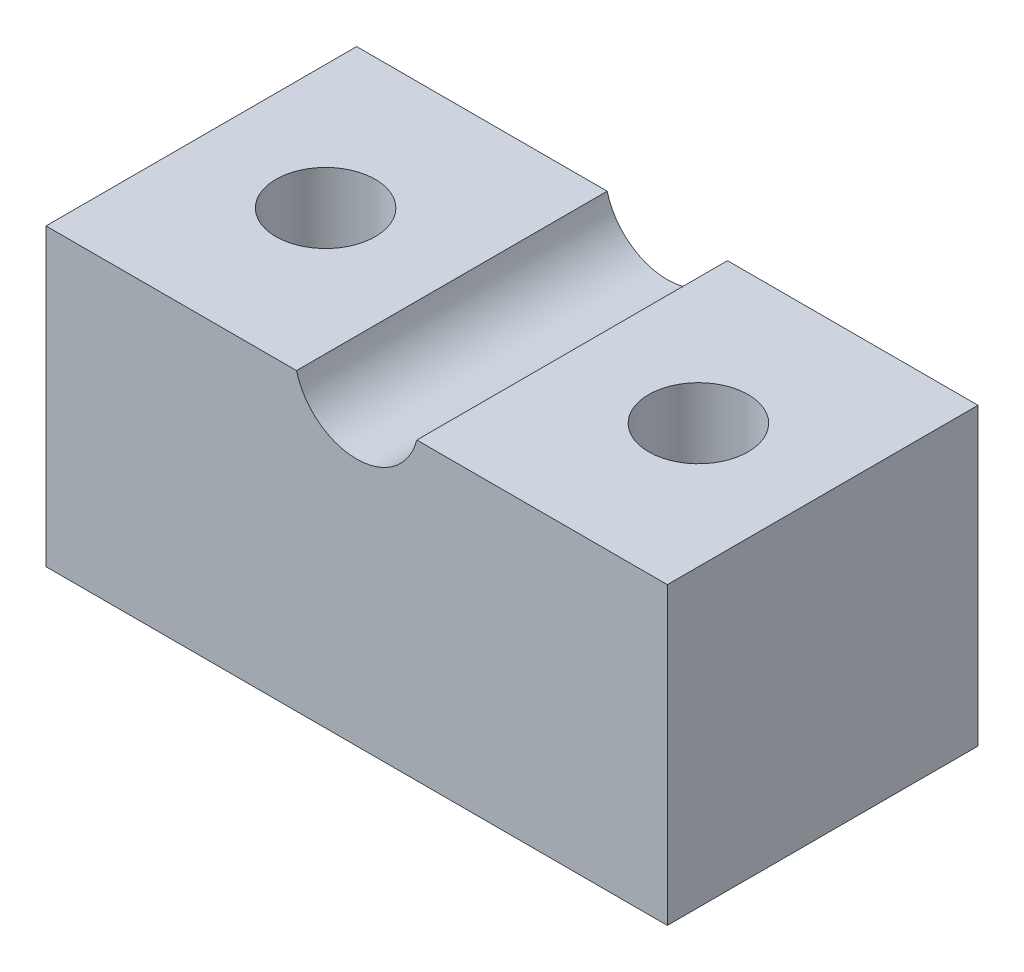
ISO-10303-21;
HEADER;
FILE_DESCRIPTION(('STEP AP214'),'2;1');
FILE_NAME('part.step','',(''),(''),'','','');
FILE_SCHEMA(('AUTOMOTIVE_DESIGN { 1 0 10303 214 1 1 1 1 }'));
ENDSEC;
DATA;
#1=APPLICATION_CONTEXT('core data for automotive mechanical design processes');
#2=APPLICATION_PROTOCOL_DEFINITION('international standard','automotive_design',2000,#1);
#3=PRODUCT_CONTEXT('',#1,'mechanical');
#4=PRODUCT('Part','Part','',(#3));
#5=PRODUCT_RELATED_PRODUCT_CATEGORY('part','',(#4));
#6=PRODUCT_DEFINITION_FORMATION('','',#4);
#7=PRODUCT_DEFINITION_CONTEXT('part definition',#1,'design');
#8=PRODUCT_DEFINITION('design','',#6,#7);
#9=PRODUCT_DEFINITION_SHAPE('','',#8);
#10=(LENGTH_UNIT() NAMED_UNIT(*) SI_UNIT(.MILLI.,.METRE.));
#11=(NAMED_UNIT(*) PLANE_ANGLE_UNIT() SI_UNIT($,.RADIAN.));
#12=(NAMED_UNIT(*) SI_UNIT($,.STERADIAN.) SOLID_ANGLE_UNIT());
#13=UNCERTAINTY_MEASURE_WITH_UNIT(LENGTH_MEASURE(1.E-05),#10,'distance_accuracy_value','');
#14=(GEOMETRIC_REPRESENTATION_CONTEXT(3) GLOBAL_UNCERTAINTY_ASSIGNED_CONTEXT((#13)) GLOBAL_UNIT_ASSIGNED_CONTEXT((#10,
#11,#12)) REPRESENTATION_CONTEXT('',''));
#15=CARTESIAN_POINT('',(0.,0.,0.));
#16=DIRECTION('',(0.,0.,1.));
#17=DIRECTION('',(1.,0.,0.));
#18=AXIS2_PLACEMENT_3D('',#15,#16,#17);
#19=CARTESIAN_POINT('',(6.,-10.,5.));
#20=DIRECTION('',(0.,1.,0.));
#21=DIRECTION('',(0.,0.,1.));
#22=AXIS2_PLACEMENT_3D('',#19,#20,#21);
#23=CYLINDRICAL_SURFACE('',#22,1.6);
#24=CARTESIAN_POINT('',(6.,-0.5,5.));
#25=DIRECTION('',(0.,1.,0.));
#26=DIRECTION('',(0.,0.,1.));
#27=AXIS2_PLACEMENT_3D('',#24,#25,#26);
#28=CIRCLE('',#27,1.6);
#29=CARTESIAN_POINT('',(6.,-0.5,6.6));
#30=VERTEX_POINT('',#29);
#31=EDGE_CURVE('E272',#30,#30,#28,.T.);
#32=ORIENTED_EDGE('',*,*,#31,.T.);
#33=EDGE_LOOP('',(#32));
#34=FACE_BOUND('',#33,.T.);
#35=CARTESIAN_POINT('',(6.,-7.,5.));
#36=DIRECTION('',(0.,-1.,0.));
#37=DIRECTION('',(0.,0.,-1.));
#38=AXIS2_PLACEMENT_3D('',#35,#36,#37);
#39=CIRCLE('',#38,1.6);
#40=CARTESIAN_POINT('',(6.,-7.,3.4));
#41=VERTEX_POINT('',#40);
#42=EDGE_CURVE('E44',#41,#41,#39,.F.);
#43=ORIENTED_EDGE('',*,*,#42,.F.);
#44=EDGE_LOOP('',(#43));
#45=FACE_BOUND('',#44,.T.);
#46=ADVANCED_FACE('F40',(#34,#45),#23,.F.);
#47=CARTESIAN_POINT('',(-6.,-10.,5.));
#48=DIRECTION('',(0.,1.,0.));
#49=DIRECTION('',(0.,0.,1.));
#50=AXIS2_PLACEMENT_3D('',#47,#48,#49);
#51=CYLINDRICAL_SURFACE('',#50,1.6);
#52=CARTESIAN_POINT('',(-6.,-0.5,5.));
#53=DIRECTION('',(0.,1.,0.));
#54=DIRECTION('',(0.,0.,1.));
#55=AXIS2_PLACEMENT_3D('',#52,#53,#54);
#56=CIRCLE('',#55,1.6);
#57=CARTESIAN_POINT('',(-6.,-0.5,6.6));
#58=VERTEX_POINT('',#57);
#59=EDGE_CURVE('E268',#58,#58,#56,.T.);
#60=ORIENTED_EDGE('',*,*,#59,.T.);
#61=EDGE_LOOP('',(#60));
#62=FACE_BOUND('',#61,.T.);
#63=CARTESIAN_POINT('',(-6.,-7.,5.));
#64=DIRECTION('',(0.,-1.,0.));
#65=DIRECTION('',(0.,0.,-1.));
#66=AXIS2_PLACEMENT_3D('',#63,#64,#65);
#67=CIRCLE('',#66,1.6);
#68=CARTESIAN_POINT('',(-6.,-7.,3.4));
#69=VERTEX_POINT('',#68);
#70=EDGE_CURVE('E215',#69,#69,#67,.F.);
#71=ORIENTED_EDGE('',*,*,#70,.F.);
#72=EDGE_LOOP('',(#71));
#73=FACE_BOUND('',#72,.T.);
#74=ADVANCED_FACE('F324',(#62,#73),#51,.F.);
#75=CARTESIAN_POINT('',(0.,0.,10.));
#76=DIRECTION('',(0.,0.,-1.));
#77=DIRECTION('',(-1.,0.,0.));
#78=AXIS2_PLACEMENT_3D('',#75,#76,#77);
#79=CYLINDRICAL_SURFACE('',#78,2.);
#80=CARTESIAN_POINT('',(0.,0.,0.));
#81=DIRECTION('',(0.,0.,1.));
#82=DIRECTION('',(1.,0.,0.));
#83=AXIS2_PLACEMENT_3D('',#80,#81,#82);
#84=CIRCLE('',#83,2.);
#85=CARTESIAN_POINT('',(-1.93649167310371,-0.5,0.));
#86=VERTEX_POINT('',#85);
#87=CARTESIAN_POINT('',(1.93649167310371,-0.5,0.));
#88=VERTEX_POINT('',#87);
#89=EDGE_CURVE('E271',#86,#88,#84,.T.);
#90=ORIENTED_EDGE('',*,*,#89,.F.);
#91=DIRECTION('',(0.,0.,-1.));
#92=VECTOR('',#91,1.);
#93=CARTESIAN_POINT('',(-1.93649167310371,-0.5,10.));
#94=LINE('',#93,#92);
#95=CARTESIAN_POINT('',(-1.93649167310371,-0.5,10.));
#96=VERTEX_POINT('',#95);
#97=EDGE_CURVE('E11',#96,#86,#94,.T.);
#98=ORIENTED_EDGE('',*,*,#97,.F.);
#99=CARTESIAN_POINT('',(0.,0.,10.));
#100=DIRECTION('',(0.,0.,1.));
#101=DIRECTION('',(1.,0.,0.));
#102=AXIS2_PLACEMENT_3D('',#99,#100,#101);
#103=CIRCLE('',#102,2.);
#104=CARTESIAN_POINT('',(1.93649167310371,-0.5,10.));
#105=VERTEX_POINT('',#104);
#106=EDGE_CURVE('E273',#96,#105,#103,.T.);
#107=ORIENTED_EDGE('',*,*,#106,.T.);
#108=DIRECTION('',(0.,0.,-1.));
#109=VECTOR('',#108,1.);
#110=CARTESIAN_POINT('',(1.93649167310371,-0.5,10.));
#111=LINE('',#110,#109);
#112=EDGE_CURVE('E290',#105,#88,#111,.T.);
#113=ORIENTED_EDGE('',*,*,#112,.T.);
#114=EDGE_LOOP('',(#90,#98,#107,#113));
#115=FACE_BOUND('',#114,.T.);
#116=ADVANCED_FACE('F42',(#115),#79,.F.);
#117=CARTESIAN_POINT('',(0.,-0.5,10.));
#118=DIRECTION('',(0.,1.,0.));
#119=DIRECTION('',(0.,0.,1.));
#120=AXIS2_PLACEMENT_3D('',#117,#118,#119);
#121=PLANE('',#120);
#122=ORIENTED_EDGE('',*,*,#59,.F.);
#123=EDGE_LOOP('',(#122));
#124=FACE_BOUND('',#123,.T.);
#125=DIRECTION('',(1.,0.,0.));
#126=VECTOR('',#125,1.);
#127=CARTESIAN_POINT('',(0.,-0.5,0.));
#128=LINE('',#127,#126);
#129=CARTESIAN_POINT('',(-10.,-0.5,0.));
#130=VERTEX_POINT('',#129);
#131=EDGE_CURVE('E293',#130,#86,#128,.T.);
#132=ORIENTED_EDGE('',*,*,#131,.F.);
#133=DIRECTION('',(0.,0.,-1.));
#134=VECTOR('',#133,1.);
#135=CARTESIAN_POINT('',(-10.,-0.5,10.));
#136=LINE('',#135,#134);
#137=CARTESIAN_POINT('',(-10.,-0.5,10.));
#138=VERTEX_POINT('',#137);
#139=EDGE_CURVE('E49',#138,#130,#136,.T.);
#140=ORIENTED_EDGE('',*,*,#139,.F.);
#141=DIRECTION('',(1.,0.,0.));
#142=VECTOR('',#141,1.);
#143=CARTESIAN_POINT('',(0.,-0.5,10.));
#144=LINE('',#143,#142);
#145=EDGE_CURVE('E276',#138,#96,#144,.T.);
#146=ORIENTED_EDGE('',*,*,#145,.T.);
#147=ORIENTED_EDGE('',*,*,#97,.T.);
#148=EDGE_LOOP('',(#132,#140,#146,#147));
#149=FACE_BOUND('',#148,.T.);
#150=ADVANCED_FACE('F356',(#124,#149),#121,.T.);
#151=CARTESIAN_POINT('',(-10.,0.,10.));
#152=DIRECTION('',(-1.,0.,0.));
#153=DIRECTION('',(0.,0.,1.));
#154=AXIS2_PLACEMENT_3D('',#151,#152,#153);
#155=PLANE('',#154);
#156=DIRECTION('',(0.,1.,0.));
#157=VECTOR('',#156,1.);
#158=CARTESIAN_POINT('',(-10.,0.,0.));
#159=LINE('',#158,#157);
#160=CARTESIAN_POINT('',(-10.,-10.,0.));
#161=VERTEX_POINT('',#160);
#162=EDGE_CURVE('E296',#161,#130,#159,.T.);
#163=ORIENTED_EDGE('',*,*,#162,.F.);
#164=DIRECTION('',(0.,0.,-1.));
#165=VECTOR('',#164,1.);
#166=CARTESIAN_POINT('',(-10.,-10.,10.));
#167=LINE('',#166,#165);
#168=CARTESIAN_POINT('',(-10.,-10.,10.));
#169=VERTEX_POINT('',#168);
#170=EDGE_CURVE('E312',#169,#161,#167,.T.);
#171=ORIENTED_EDGE('',*,*,#170,.F.);
#172=DIRECTION('',(0.,1.,0.));
#173=VECTOR('',#172,1.);
#174=CARTESIAN_POINT('',(-10.,0.,10.));
#175=LINE('',#174,#173);
#176=EDGE_CURVE('E280',#169,#138,#175,.T.);
#177=ORIENTED_EDGE('',*,*,#176,.T.);
#178=ORIENTED_EDGE('',*,*,#139,.T.);
#179=EDGE_LOOP('',(#163,#171,#177,#178));
#180=FACE_BOUND('',#179,.T.);
#181=ADVANCED_FACE('F353',(#180),#155,.T.);
#182=CARTESIAN_POINT('',(0.,-10.,10.));
#183=DIRECTION('',(0.,1.,0.));
#184=DIRECTION('',(0.,0.,1.));
#185=AXIS2_PLACEMENT_3D('',#182,#183,#184);
#186=PLANE('',#185);
#187=DIRECTION('',(-1.,0.,0.));
#188=VECTOR('',#187,1.);
#189=CARTESIAN_POINT('',(-4.41228675972853,-10.,7.75));
#190=LINE('',#189,#188);
#191=CARTESIAN_POINT('',(-4.41228675972853,-10.,7.75));
#192=VERTEX_POINT('',#191);
#193=CARTESIAN_POINT('',(-7.58771324027147,-10.,7.75));
#194=VERTEX_POINT('',#193);
#195=EDGE_CURVE('E202',#192,#194,#190,.T.);
#196=ORIENTED_EDGE('',*,*,#195,.F.);
#197=DIRECTION('',(-0.5,0.,0.866025403784438));
#198=VECTOR('',#197,1.);
#199=CARTESIAN_POINT('',(-2.82457351945706,-10.,5.));
#200=LINE('',#199,#198);
#201=CARTESIAN_POINT('',(-2.82457351945706,-10.,5.));
#202=VERTEX_POINT('',#201);
#203=EDGE_CURVE('E57',#202,#192,#200,.T.);
#204=ORIENTED_EDGE('',*,*,#203,.F.);
#205=DIRECTION('',(0.5,0.,0.866025403784439));
#206=VECTOR('',#205,1.);
#207=CARTESIAN_POINT('',(-4.41228675972853,-10.,2.25));
#208=LINE('',#207,#206);
#209=CARTESIAN_POINT('',(-4.41228675972853,-10.,2.25));
#210=VERTEX_POINT('',#209);
#211=EDGE_CURVE('E188',#210,#202,#208,.T.);
#212=ORIENTED_EDGE('',*,*,#211,.F.);
#213=DIRECTION('',(1.,0.,0.));
#214=VECTOR('',#213,1.);
#215=CARTESIAN_POINT('',(-7.58771324027147,-10.,2.25));
#216=LINE('',#215,#214);
#217=CARTESIAN_POINT('',(-7.58771324027147,-10.,2.25));
#218=VERTEX_POINT('',#217);
#219=EDGE_CURVE('E191',#218,#210,#216,.T.);
#220=ORIENTED_EDGE('',*,*,#219,.F.);
#221=DIRECTION('',(0.5,0.,-0.866025403784439));
#222=VECTOR('',#221,1.);
#223=CARTESIAN_POINT('',(-9.17542648054294,-10.,5.));
#224=LINE('',#223,#222);
#225=CARTESIAN_POINT('',(-9.17542648054294,-10.,5.));
#226=VERTEX_POINT('',#225);
#227=EDGE_CURVE('E208',#226,#218,#224,.T.);
#228=ORIENTED_EDGE('',*,*,#227,.F.);
#229=DIRECTION('',(-0.499999999999999,0.,-0.866025403784439));
#230=VECTOR('',#229,1.);
#231=CARTESIAN_POINT('',(-7.58771324027147,-10.,7.75));
#232=LINE('',#231,#230);
#233=EDGE_CURVE('E205',#194,#226,#232,.T.);
#234=ORIENTED_EDGE('',*,*,#233,.F.);
#235=EDGE_LOOP('',(#196,#204,#212,#220,#228,#234));
#236=FACE_BOUND('',#235,.T.);
#237=DIRECTION('',(-1.,0.,0.));
#238=VECTOR('',#237,1.);
#239=CARTESIAN_POINT('',(7.58771324027147,-10.,7.75));
#240=LINE('',#239,#238);
#241=CARTESIAN_POINT('',(7.58771324027147,-10.,7.75));
#242=VERTEX_POINT('',#241);
#243=CARTESIAN_POINT('',(4.41228675972853,-10.,7.75));
#244=VERTEX_POINT('',#243);
#245=EDGE_CURVE('E244',#242,#244,#240,.T.);
#246=ORIENTED_EDGE('',*,*,#245,.F.);
#247=DIRECTION('',(-0.5,0.,0.866025403784439));
#248=VECTOR('',#247,1.);
#249=CARTESIAN_POINT('',(9.17542648054294,-10.,5.));
#250=LINE('',#249,#248);
#251=CARTESIAN_POINT('',(9.17542648054294,-10.,5.));
#252=VERTEX_POINT('',#251);
#253=EDGE_CURVE('E65',#252,#242,#250,.T.);
#254=ORIENTED_EDGE('',*,*,#253,.F.);
#255=DIRECTION('',(0.499999999999999,0.,0.866025403784439));
#256=VECTOR('',#255,1.);
#257=CARTESIAN_POINT('',(7.58771324027147,-10.,2.25));
#258=LINE('',#257,#256);
#259=CARTESIAN_POINT('',(7.58771324027147,-10.,2.25));
#260=VERTEX_POINT('',#259);
#261=EDGE_CURVE('E227',#260,#252,#258,.T.);
#262=ORIENTED_EDGE('',*,*,#261,.F.);
#263=DIRECTION('',(1.,0.,0.));
#264=VECTOR('',#263,1.);
#265=CARTESIAN_POINT('',(4.41228675972853,-10.,2.25));
#266=LINE('',#265,#264);
#267=CARTESIAN_POINT('',(4.41228675972853,-10.,2.25));
#268=VERTEX_POINT('',#267);
#269=EDGE_CURVE('E253',#268,#260,#266,.T.);
#270=ORIENTED_EDGE('',*,*,#269,.F.);
#271=DIRECTION('',(0.500000000000001,0.,-0.866025403784438));
#272=VECTOR('',#271,1.);
#273=CARTESIAN_POINT('',(2.82457351945706,-10.,5.));
#274=LINE('',#273,#272);
#275=CARTESIAN_POINT('',(2.82457351945706,-10.,5.));
#276=VERTEX_POINT('',#275);
#277=EDGE_CURVE('E250',#276,#268,#274,.T.);
#278=ORIENTED_EDGE('',*,*,#277,.F.);
#279=DIRECTION('',(-0.5,0.,-0.866025403784439));
#280=VECTOR('',#279,1.);
#281=CARTESIAN_POINT('',(4.41228675972853,-10.,7.75));
#282=LINE('',#281,#280);
#283=EDGE_CURVE('E247',#244,#276,#282,.T.);
#284=ORIENTED_EDGE('',*,*,#283,.F.);
#285=EDGE_LOOP('',(#246,#254,#262,#270,#278,#284));
#286=FACE_BOUND('',#285,.T.);
#287=DIRECTION('',(1.,0.,0.));
#288=VECTOR('',#287,1.);
#289=CARTESIAN_POINT('',(0.,-10.,0.));
#290=LINE('',#289,#288);
#291=CARTESIAN_POINT('',(10.,-10.,0.));
#292=VERTEX_POINT('',#291);
#293=EDGE_CURVE('E299',#161,#292,#290,.T.);
#294=ORIENTED_EDGE('',*,*,#293,.T.);
#295=DIRECTION('',(0.,0.,-1.));
#296=VECTOR('',#295,1.);
#297=CARTESIAN_POINT('',(10.,-10.,10.));
#298=LINE('',#297,#296);
#299=CARTESIAN_POINT('',(10.,-10.,10.));
#300=VERTEX_POINT('',#299);
#301=EDGE_CURVE('E309',#300,#292,#298,.T.);
#302=ORIENTED_EDGE('',*,*,#301,.F.);
#303=DIRECTION('',(1.,0.,0.));
#304=VECTOR('',#303,1.);
#305=CARTESIAN_POINT('',(0.,-10.,10.));
#306=LINE('',#305,#304);
#307=EDGE_CURVE('E283',#169,#300,#306,.T.);
#308=ORIENTED_EDGE('',*,*,#307,.F.);
#309=ORIENTED_EDGE('',*,*,#170,.T.);
#310=EDGE_LOOP('',(#294,#302,#308,#309));
#311=FACE_BOUND('',#310,.T.);
#312=ADVANCED_FACE('F349',(#236,#286,#311),#186,.F.);
#313=CARTESIAN_POINT('',(10.,0.,10.));
#314=DIRECTION('',(-1.,0.,0.));
#315=DIRECTION('',(0.,-1.,0.));
#316=AXIS2_PLACEMENT_3D('',#313,#314,#315);
#317=PLANE('',#316);
#318=DIRECTION('',(0.,1.,0.));
#319=VECTOR('',#318,1.);
#320=CARTESIAN_POINT('',(10.,0.,0.));
#321=LINE('',#320,#319);
#322=CARTESIAN_POINT('',(10.,-0.5,0.));
#323=VERTEX_POINT('',#322);
#324=EDGE_CURVE('E301',#292,#323,#321,.T.);
#325=ORIENTED_EDGE('',*,*,#324,.T.);
#326=DIRECTION('',(0.,0.,-1.));
#327=VECTOR('',#326,1.);
#328=CARTESIAN_POINT('',(10.,-0.5,10.));
#329=LINE('',#328,#327);
#330=CARTESIAN_POINT('',(10.,-0.5,10.));
#331=VERTEX_POINT('',#330);
#332=EDGE_CURVE('E307',#331,#323,#329,.T.);
#333=ORIENTED_EDGE('',*,*,#332,.F.);
#334=DIRECTION('',(0.,1.,0.));
#335=VECTOR('',#334,1.);
#336=CARTESIAN_POINT('',(10.,0.,10.));
#337=LINE('',#336,#335);
#338=EDGE_CURVE('E285',#300,#331,#337,.T.);
#339=ORIENTED_EDGE('',*,*,#338,.F.);
#340=ORIENTED_EDGE('',*,*,#301,.T.);
#341=EDGE_LOOP('',(#325,#333,#339,#340));
#342=FACE_BOUND('',#341,.T.);
#343=ADVANCED_FACE('F345',(#342),#317,.F.);
#344=CARTESIAN_POINT('',(0.,-0.5,10.));
#345=DIRECTION('',(0.,1.,0.));
#346=DIRECTION('',(0.,0.,1.));
#347=AXIS2_PLACEMENT_3D('',#344,#345,#346);
#348=PLANE('',#347);
#349=ORIENTED_EDGE('',*,*,#31,.F.);
#350=EDGE_LOOP('',(#349));
#351=FACE_BOUND('',#350,.T.);
#352=DIRECTION('',(1.,0.,0.));
#353=VECTOR('',#352,1.);
#354=CARTESIAN_POINT('',(0.,-0.5,0.));
#355=LINE('',#354,#353);
#356=EDGE_CURVE('E277',#88,#323,#355,.T.);
#357=ORIENTED_EDGE('',*,*,#356,.F.);
#358=ORIENTED_EDGE('',*,*,#112,.F.);
#359=DIRECTION('',(1.,0.,0.));
#360=VECTOR('',#359,1.);
#361=CARTESIAN_POINT('',(0.,-0.5,10.));
#362=LINE('',#361,#360);
#363=EDGE_CURVE('E287',#105,#331,#362,.T.);
#364=ORIENTED_EDGE('',*,*,#363,.T.);
#365=ORIENTED_EDGE('',*,*,#332,.T.);
#366=EDGE_LOOP('',(#357,#358,#364,#365));
#367=FACE_BOUND('',#366,.T.);
#368=ADVANCED_FACE('F338',(#351,#367),#348,.T.);
#369=CARTESIAN_POINT('',(0.,0.,10.));
#370=DIRECTION('',(0.,0.,1.));
#371=DIRECTION('',(1.,0.,0.));
#372=AXIS2_PLACEMENT_3D('',#369,#370,#371);
#373=PLANE('',#372);
#374=ORIENTED_EDGE('',*,*,#106,.F.);
#375=ORIENTED_EDGE('',*,*,#145,.F.);
#376=ORIENTED_EDGE('',*,*,#176,.F.);
#377=ORIENTED_EDGE('',*,*,#307,.T.);
#378=ORIENTED_EDGE('',*,*,#338,.T.);
#379=ORIENTED_EDGE('',*,*,#363,.F.);
#380=EDGE_LOOP('',(#374,#375,#376,#377,#378,#379));
#381=FACE_BOUND('',#380,.T.);
#382=ADVANCED_FACE('F334',(#381),#373,.T.);
#383=CARTESIAN_POINT('',(0.,0.,0.));
#384=DIRECTION('',(0.,0.,1.));
#385=DIRECTION('',(1.,0.,0.));
#386=AXIS2_PLACEMENT_3D('',#383,#384,#385);
#387=PLANE('',#386);
#388=ORIENTED_EDGE('',*,*,#89,.T.);
#389=ORIENTED_EDGE('',*,*,#356,.T.);
#390=ORIENTED_EDGE('',*,*,#324,.F.);
#391=ORIENTED_EDGE('',*,*,#293,.F.);
#392=ORIENTED_EDGE('',*,*,#162,.T.);
#393=ORIENTED_EDGE('',*,*,#131,.T.);
#394=EDGE_LOOP('',(#388,#389,#390,#391,#392,#393));
#395=FACE_BOUND('',#394,.T.);
#396=ADVANCED_FACE('F337',(#395),#387,.F.);
#397=CARTESIAN_POINT('',(0.,-7.,0.));
#398=DIRECTION('',(0.,-1.,0.));
#399=DIRECTION('',(0.,0.,-1.));
#400=AXIS2_PLACEMENT_3D('',#397,#398,#399);
#401=PLANE('',#400);
#402=DIRECTION('',(-0.5,0.,0.866025403784438));
#403=VECTOR('',#402,1.);
#404=CARTESIAN_POINT('',(-2.82457351945706,-7.,5.));
#405=LINE('',#404,#403);
#406=CARTESIAN_POINT('',(-2.82457351945706,-7.,5.));
#407=VERTEX_POINT('',#406);
#408=CARTESIAN_POINT('',(-4.41228675972853,-7.,7.75));
#409=VERTEX_POINT('',#408);
#410=EDGE_CURVE('E168',#407,#409,#405,.T.);
#411=ORIENTED_EDGE('',*,*,#410,.T.);
#412=DIRECTION('',(-1.,0.,0.));
#413=VECTOR('',#412,1.);
#414=CARTESIAN_POINT('',(-4.41228675972853,-7.,7.75));
#415=LINE('',#414,#413);
#416=CARTESIAN_POINT('',(-7.58771324027147,-7.,7.75));
#417=VERTEX_POINT('',#416);
#418=EDGE_CURVE('E177',#409,#417,#415,.T.);
#419=ORIENTED_EDGE('',*,*,#418,.T.);
#420=DIRECTION('',(-0.499999999999999,0.,-0.866025403784439));
#421=VECTOR('',#420,1.);
#422=CARTESIAN_POINT('',(-7.58771324027147,-7.,7.75));
#423=LINE('',#422,#421);
#424=CARTESIAN_POINT('',(-9.17542648054294,-7.,5.));
#425=VERTEX_POINT('',#424);
#426=EDGE_CURVE('E182',#417,#425,#423,.T.);
#427=ORIENTED_EDGE('',*,*,#426,.T.);
#428=DIRECTION('',(0.5,0.,-0.866025403784439));
#429=VECTOR('',#428,1.);
#430=CARTESIAN_POINT('',(-9.17542648054294,-7.,5.));
#431=LINE('',#430,#429);
#432=CARTESIAN_POINT('',(-7.58771324027147,-7.,2.25));
#433=VERTEX_POINT('',#432);
#434=EDGE_CURVE('E195',#425,#433,#431,.T.);
#435=ORIENTED_EDGE('',*,*,#434,.T.);
#436=DIRECTION('',(1.,0.,0.));
#437=VECTOR('',#436,1.);
#438=CARTESIAN_POINT('',(-7.58771324027147,-7.,2.25));
#439=LINE('',#438,#437);
#440=CARTESIAN_POINT('',(-4.41228675972853,-7.,2.25));
#441=VERTEX_POINT('',#440);
#442=EDGE_CURVE('E198',#433,#441,#439,.T.);
#443=ORIENTED_EDGE('',*,*,#442,.T.);
#444=DIRECTION('',(0.5,0.,0.866025403784439));
#445=VECTOR('',#444,1.);
#446=CARTESIAN_POINT('',(-4.41228675972853,-7.,2.25));
#447=LINE('',#446,#445);
#448=EDGE_CURVE('E174',#441,#407,#447,.T.);
#449=ORIENTED_EDGE('',*,*,#448,.T.);
#450=EDGE_LOOP('',(#411,#419,#427,#435,#443,#449));
#451=FACE_BOUND('',#450,.T.);
#452=ORIENTED_EDGE('',*,*,#70,.T.);
#453=EDGE_LOOP('',(#452));
#454=FACE_BOUND('',#453,.T.);
#455=ADVANCED_FACE('F184',(#451,#454),#401,.T.);
#456=CARTESIAN_POINT('',(-2.82457351945706,-7.,5.));
#457=DIRECTION('',(0.866025403784438,0.,0.5));
#458=DIRECTION('',(0.5,0.,-0.866025403784439));
#459=AXIS2_PLACEMENT_3D('',#456,#457,#458);
#460=PLANE('',#459);
#461=ORIENTED_EDGE('',*,*,#203,.T.);
#462=DIRECTION('',(0.,-1.,0.));
#463=VECTOR('',#462,1.);
#464=CARTESIAN_POINT('',(-4.41228675972853,-7.,7.75));
#465=LINE('',#464,#463);
#466=EDGE_CURVE('E164',#409,#192,#465,.T.);
#467=ORIENTED_EDGE('',*,*,#466,.F.);
#468=ORIENTED_EDGE('',*,*,#410,.F.);
#469=DIRECTION('',(0.,-1.,0.));
#470=VECTOR('',#469,1.);
#471=CARTESIAN_POINT('',(-2.82457351945706,-7.,5.));
#472=LINE('',#471,#470);
#473=EDGE_CURVE('E213',#407,#202,#472,.T.);
#474=ORIENTED_EDGE('',*,*,#473,.T.);
#475=EDGE_LOOP('',(#461,#467,#468,#474));
#476=FACE_BOUND('',#475,.T.);
#477=ADVANCED_FACE('F166',(#476),#460,.F.);
#478=CARTESIAN_POINT('',(-4.41228675972853,-7.,2.25));
#479=DIRECTION('',(0.866025403784439,0.,-0.5));
#480=DIRECTION('',(-0.5,0.,-0.866025403784439));
#481=AXIS2_PLACEMENT_3D('',#478,#479,#480);
#482=PLANE('',#481);
#483=ORIENTED_EDGE('',*,*,#211,.T.);
#484=ORIENTED_EDGE('',*,*,#473,.F.);
#485=ORIENTED_EDGE('',*,*,#448,.F.);
#486=DIRECTION('',(0.,-1.,0.));
#487=VECTOR('',#486,1.);
#488=CARTESIAN_POINT('',(-4.41228675972853,-7.,2.25));
#489=LINE('',#488,#487);
#490=EDGE_CURVE('E216',#441,#210,#489,.T.);
#491=ORIENTED_EDGE('',*,*,#490,.T.);
#492=EDGE_LOOP('',(#483,#484,#485,#491));
#493=FACE_BOUND('',#492,.T.);
#494=ADVANCED_FACE('F445',(#493),#482,.F.);
#495=CARTESIAN_POINT('',(-7.58771324027147,-7.,2.25));
#496=DIRECTION('',(0.,0.,-1.));
#497=DIRECTION('',(-1.,0.,0.));
#498=AXIS2_PLACEMENT_3D('',#495,#496,#497);
#499=PLANE('',#498);
#500=ORIENTED_EDGE('',*,*,#219,.T.);
#501=ORIENTED_EDGE('',*,*,#490,.F.);
#502=ORIENTED_EDGE('',*,*,#442,.F.);
#503=DIRECTION('',(0.,-1.,0.));
#504=VECTOR('',#503,1.);
#505=CARTESIAN_POINT('',(-7.58771324027147,-7.,2.25));
#506=LINE('',#505,#504);
#507=EDGE_CURVE('E218',#433,#218,#506,.T.);
#508=ORIENTED_EDGE('',*,*,#507,.T.);
#509=EDGE_LOOP('',(#500,#501,#502,#508));
#510=FACE_BOUND('',#509,.T.);
#511=ADVANCED_FACE('F453',(#510),#499,.F.);
#512=CARTESIAN_POINT('',(-9.17542648054294,-7.,5.));
#513=DIRECTION('',(-0.866025403784438,0.,-0.5));
#514=DIRECTION('',(-0.5,0.,0.866025403784439));
#515=AXIS2_PLACEMENT_3D('',#512,#513,#514);
#516=PLANE('',#515);
#517=ORIENTED_EDGE('',*,*,#227,.T.);
#518=ORIENTED_EDGE('',*,*,#507,.F.);
#519=ORIENTED_EDGE('',*,*,#434,.F.);
#520=DIRECTION('',(0.,-1.,0.));
#521=VECTOR('',#520,1.);
#522=CARTESIAN_POINT('',(-9.17542648054294,-7.,5.));
#523=LINE('',#522,#521);
#524=EDGE_CURVE('E220',#425,#226,#523,.T.);
#525=ORIENTED_EDGE('',*,*,#524,.T.);
#526=EDGE_LOOP('',(#517,#518,#519,#525));
#527=FACE_BOUND('',#526,.T.);
#528=ADVANCED_FACE('F462',(#527),#516,.F.);
#529=CARTESIAN_POINT('',(-7.58771324027147,-7.,7.75));
#530=DIRECTION('',(-0.866025403784439,0.,0.499999999999999));
#531=DIRECTION('',(0.499999999999999,0.,0.866025403784439));
#532=AXIS2_PLACEMENT_3D('',#529,#530,#531);
#533=PLANE('',#532);
#534=ORIENTED_EDGE('',*,*,#233,.T.);
#535=ORIENTED_EDGE('',*,*,#524,.F.);
#536=ORIENTED_EDGE('',*,*,#426,.F.);
#537=DIRECTION('',(0.,-1.,0.));
#538=VECTOR('',#537,1.);
#539=CARTESIAN_POINT('',(-7.58771324027147,-7.,7.75));
#540=LINE('',#539,#538);
#541=EDGE_CURVE('E173',#417,#194,#540,.T.);
#542=ORIENTED_EDGE('',*,*,#541,.T.);
#543=EDGE_LOOP('',(#534,#535,#536,#542));
#544=FACE_BOUND('',#543,.T.);
#545=ADVANCED_FACE('F471',(#544),#533,.F.);
#546=CARTESIAN_POINT('',(-4.41228675972853,-7.,7.75));
#547=DIRECTION('',(0.,0.,1.));
#548=DIRECTION('',(1.,0.,0.));
#549=AXIS2_PLACEMENT_3D('',#546,#547,#548);
#550=PLANE('',#549);
#551=ORIENTED_EDGE('',*,*,#195,.T.);
#552=ORIENTED_EDGE('',*,*,#541,.F.);
#553=ORIENTED_EDGE('',*,*,#418,.F.);
#554=ORIENTED_EDGE('',*,*,#466,.T.);
#555=EDGE_LOOP('',(#551,#552,#553,#554));
#556=FACE_BOUND('',#555,.T.);
#557=ADVANCED_FACE('F178',(#556),#550,.F.);
#558=CARTESIAN_POINT('',(0.,-7.,0.));
#559=DIRECTION('',(0.,-1.,0.));
#560=DIRECTION('',(0.,0.,-1.));
#561=AXIS2_PLACEMENT_3D('',#558,#559,#560);
#562=PLANE('',#561);
#563=DIRECTION('',(-0.5,0.,0.866025403784439));
#564=VECTOR('',#563,1.);
#565=CARTESIAN_POINT('',(9.17542648054294,-7.,5.));
#566=LINE('',#565,#564);
#567=CARTESIAN_POINT('',(9.17542648054294,-7.,5.));
#568=VERTEX_POINT('',#567);
#569=CARTESIAN_POINT('',(7.58771324027147,-7.,7.75));
#570=VERTEX_POINT('',#569);
#571=EDGE_CURVE('E223',#568,#570,#566,.T.);
#572=ORIENTED_EDGE('',*,*,#571,.T.);
#573=DIRECTION('',(-1.,0.,0.));
#574=VECTOR('',#573,1.);
#575=CARTESIAN_POINT('',(7.58771324027147,-7.,7.75));
#576=LINE('',#575,#574);
#577=CARTESIAN_POINT('',(4.41228675972853,-7.,7.75));
#578=VERTEX_POINT('',#577);
#579=EDGE_CURVE('E226',#570,#578,#576,.T.);
#580=ORIENTED_EDGE('',*,*,#579,.T.);
#581=DIRECTION('',(-0.5,0.,-0.866025403784439));
#582=VECTOR('',#581,1.);
#583=CARTESIAN_POINT('',(4.41228675972853,-7.,7.75));
#584=LINE('',#583,#582);
#585=CARTESIAN_POINT('',(2.82457351945706,-7.,5.));
#586=VERTEX_POINT('',#585);
#587=EDGE_CURVE('E230',#578,#586,#584,.T.);
#588=ORIENTED_EDGE('',*,*,#587,.T.);
#589=DIRECTION('',(0.500000000000001,0.,-0.866025403784438));
#590=VECTOR('',#589,1.);
#591=CARTESIAN_POINT('',(2.82457351945706,-7.,5.));
#592=LINE('',#591,#590);
#593=CARTESIAN_POINT('',(4.41228675972853,-7.,2.25));
#594=VERTEX_POINT('',#593);
#595=EDGE_CURVE('E233',#586,#594,#592,.T.);
#596=ORIENTED_EDGE('',*,*,#595,.T.);
#597=DIRECTION('',(1.,0.,0.));
#598=VECTOR('',#597,1.);
#599=CARTESIAN_POINT('',(4.41228675972853,-7.,2.25));
#600=LINE('',#599,#598);
#601=CARTESIAN_POINT('',(7.58771324027147,-7.,2.25));
#602=VERTEX_POINT('',#601);
#603=EDGE_CURVE('E236',#594,#602,#600,.T.);
#604=ORIENTED_EDGE('',*,*,#603,.T.);
#605=DIRECTION('',(0.499999999999999,0.,0.866025403784439));
#606=VECTOR('',#605,1.);
#607=CARTESIAN_POINT('',(7.58771324027147,-7.,2.25));
#608=LINE('',#607,#606);
#609=EDGE_CURVE('E239',#602,#568,#608,.T.);
#610=ORIENTED_EDGE('',*,*,#609,.T.);
#611=EDGE_LOOP('',(#572,#580,#588,#596,#604,#610));
#612=FACE_BOUND('',#611,.T.);
#613=ORIENTED_EDGE('',*,*,#42,.T.);
#614=EDGE_LOOP('',(#613));
#615=FACE_BOUND('',#614,.T.);
#616=ADVANCED_FACE('F321',(#612,#615),#562,.T.);
#617=CARTESIAN_POINT('',(9.17542648054294,-7.,5.));
#618=DIRECTION('',(0.866025403784438,0.,0.5));
#619=DIRECTION('',(0.5,0.,-0.866025403784439));
#620=AXIS2_PLACEMENT_3D('',#617,#618,#619);
#621=PLANE('',#620);
#622=ORIENTED_EDGE('',*,*,#253,.T.);
#623=DIRECTION('',(0.,-1.,0.));
#624=VECTOR('',#623,1.);
#625=CARTESIAN_POINT('',(7.58771324027147,-7.,7.75));
#626=LINE('',#625,#624);
#627=EDGE_CURVE('E242',#570,#242,#626,.T.);
#628=ORIENTED_EDGE('',*,*,#627,.F.);
#629=ORIENTED_EDGE('',*,*,#571,.F.);
#630=DIRECTION('',(0.,-1.,0.));
#631=VECTOR('',#630,1.);
#632=CARTESIAN_POINT('',(9.17542648054294,-7.,5.));
#633=LINE('',#632,#631);
#634=EDGE_CURVE('E203',#568,#252,#633,.T.);
#635=ORIENTED_EDGE('',*,*,#634,.T.);
#636=EDGE_LOOP('',(#622,#628,#629,#635));
#637=FACE_BOUND('',#636,.T.);
#638=ADVANCED_FACE('F495',(#637),#621,.F.);
#639=CARTESIAN_POINT('',(7.58771324027147,-7.,2.25));
#640=DIRECTION('',(0.866025403784439,0.,-0.5));
#641=DIRECTION('',(-0.5,0.,-0.866025403784439));
#642=AXIS2_PLACEMENT_3D('',#639,#640,#641);
#643=PLANE('',#642);
#644=ORIENTED_EDGE('',*,*,#261,.T.);
#645=ORIENTED_EDGE('',*,*,#634,.F.);
#646=ORIENTED_EDGE('',*,*,#609,.F.);
#647=DIRECTION('',(0.,-1.,0.));
#648=VECTOR('',#647,1.);
#649=CARTESIAN_POINT('',(7.58771324027147,-7.,2.25));
#650=LINE('',#649,#648);
#651=EDGE_CURVE('E259',#602,#260,#650,.T.);
#652=ORIENTED_EDGE('',*,*,#651,.T.);
#653=EDGE_LOOP('',(#644,#645,#646,#652));
#654=FACE_BOUND('',#653,.T.);
#655=ADVANCED_FACE('F504',(#654),#643,.F.);
#656=CARTESIAN_POINT('',(4.41228675972853,-7.,2.25));
#657=DIRECTION('',(0.,0.,-1.));
#658=DIRECTION('',(-1.,0.,0.));
#659=AXIS2_PLACEMENT_3D('',#656,#657,#658);
#660=PLANE('',#659);
#661=ORIENTED_EDGE('',*,*,#269,.T.);
#662=ORIENTED_EDGE('',*,*,#651,.F.);
#663=ORIENTED_EDGE('',*,*,#603,.F.);
#664=DIRECTION('',(0.,-1.,0.));
#665=VECTOR('',#664,1.);
#666=CARTESIAN_POINT('',(4.41228675972853,-7.,2.25));
#667=LINE('',#666,#665);
#668=EDGE_CURVE('E261',#594,#268,#667,.T.);
#669=ORIENTED_EDGE('',*,*,#668,.T.);
#670=EDGE_LOOP('',(#661,#662,#663,#669));
#671=FACE_BOUND('',#670,.T.);
#672=ADVANCED_FACE('F511',(#671),#660,.F.);
#673=CARTESIAN_POINT('',(2.82457351945706,-7.,5.));
#674=DIRECTION('',(-0.866025403784438,0.,-0.500000000000001));
#675=DIRECTION('',(-0.500000000000001,0.,0.866025403784438));
#676=AXIS2_PLACEMENT_3D('',#673,#674,#675);
#677=PLANE('',#676);
#678=ORIENTED_EDGE('',*,*,#277,.T.);
#679=ORIENTED_EDGE('',*,*,#668,.F.);
#680=ORIENTED_EDGE('',*,*,#595,.F.);
#681=DIRECTION('',(0.,-1.,0.));
#682=VECTOR('',#681,1.);
#683=CARTESIAN_POINT('',(2.82457351945706,-7.,5.));
#684=LINE('',#683,#682);
#685=EDGE_CURVE('E263',#586,#276,#684,.T.);
#686=ORIENTED_EDGE('',*,*,#685,.T.);
#687=EDGE_LOOP('',(#678,#679,#680,#686));
#688=FACE_BOUND('',#687,.T.);
#689=ADVANCED_FACE('F520',(#688),#677,.F.);
#690=CARTESIAN_POINT('',(4.41228675972853,-7.,7.75));
#691=DIRECTION('',(-0.866025403784439,0.,0.5));
#692=DIRECTION('',(0.5,0.,0.866025403784439));
#693=AXIS2_PLACEMENT_3D('',#690,#691,#692);
#694=PLANE('',#693);
#695=ORIENTED_EDGE('',*,*,#283,.T.);
#696=ORIENTED_EDGE('',*,*,#685,.F.);
#697=ORIENTED_EDGE('',*,*,#587,.F.);
#698=DIRECTION('',(0.,-1.,0.));
#699=VECTOR('',#698,1.);
#700=CARTESIAN_POINT('',(4.41228675972853,-7.,7.75));
#701=LINE('',#700,#699);
#702=EDGE_CURVE('E265',#578,#244,#701,.T.);
#703=ORIENTED_EDGE('',*,*,#702,.T.);
#704=EDGE_LOOP('',(#695,#696,#697,#703));
#705=FACE_BOUND('',#704,.T.);
#706=ADVANCED_FACE('F529',(#705),#694,.F.);
#707=CARTESIAN_POINT('',(7.58771324027147,-7.,7.75));
#708=DIRECTION('',(0.,0.,1.));
#709=DIRECTION('',(1.,0.,0.));
#710=AXIS2_PLACEMENT_3D('',#707,#708,#709);
#711=PLANE('',#710);
#712=ORIENTED_EDGE('',*,*,#245,.T.);
#713=ORIENTED_EDGE('',*,*,#702,.F.);
#714=ORIENTED_EDGE('',*,*,#579,.F.);
#715=ORIENTED_EDGE('',*,*,#627,.T.);
#716=EDGE_LOOP('',(#712,#713,#714,#715));
#717=FACE_BOUND('',#716,.T.);
#718=ADVANCED_FACE('F538',(#717),#711,.F.);
#719=CLOSED_SHELL('',(#46,#74,#116,#150,#181,#312,#343,#368,#382,#396,#455,#477,#494,#511,#528,
#545,#557,#616,#638,#655,#672,#689,#706,#718));
#720=MANIFOLD_SOLID_BREP('B2',#719);
#721=ADVANCED_BREP_SHAPE_REPRESENTATION('',(#18,#720),#14);
#722=SHAPE_DEFINITION_REPRESENTATION(#9,#721);
ENDSEC;
END-ISO-10303-21;
